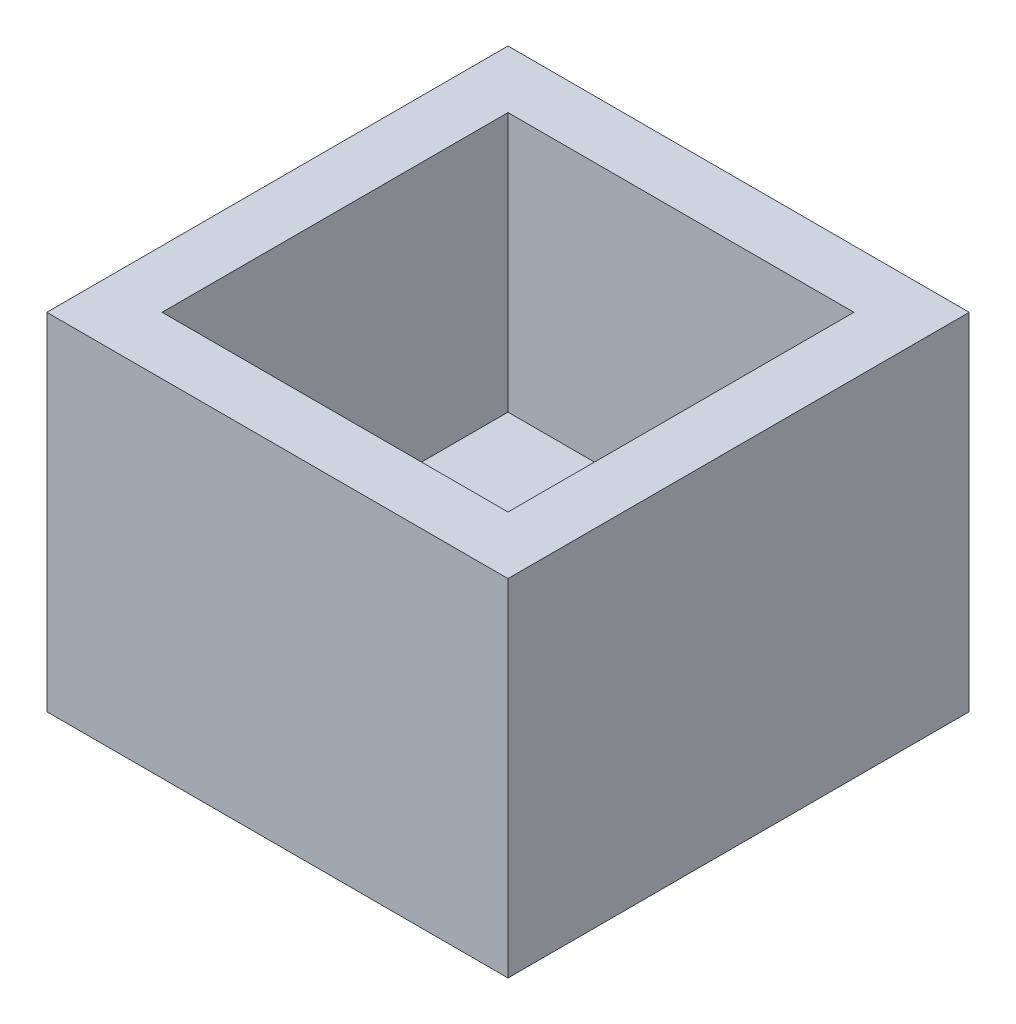
ISO-10303-21;
HEADER;
FILE_DESCRIPTION(('STEP AP214'),'2;1');
FILE_NAME('part.step','',(''),(''),'','','');
FILE_SCHEMA(('AUTOMOTIVE_DESIGN { 1 0 10303 214 1 1 1 1 }'));
ENDSEC;
DATA;
#1=APPLICATION_CONTEXT('core data for automotive mechanical design processes');
#2=APPLICATION_PROTOCOL_DEFINITION('international standard','automotive_design',2000,#1);
#3=PRODUCT_CONTEXT('',#1,'mechanical');
#4=PRODUCT('Part','Part','',(#3));
#5=PRODUCT_RELATED_PRODUCT_CATEGORY('part','',(#4));
#6=PRODUCT_DEFINITION_FORMATION('','',#4);
#7=PRODUCT_DEFINITION_CONTEXT('part definition',#1,'design');
#8=PRODUCT_DEFINITION('design','',#6,#7);
#9=PRODUCT_DEFINITION_SHAPE('','',#8);
#10=(LENGTH_UNIT() NAMED_UNIT(*) SI_UNIT(.MILLI.,.METRE.));
#11=(NAMED_UNIT(*) PLANE_ANGLE_UNIT() SI_UNIT($,.RADIAN.));
#12=(NAMED_UNIT(*) SI_UNIT($,.STERADIAN.) SOLID_ANGLE_UNIT());
#13=UNCERTAINTY_MEASURE_WITH_UNIT(LENGTH_MEASURE(1.E-05),#10,'distance_accuracy_value','');
#14=(GEOMETRIC_REPRESENTATION_CONTEXT(3) GLOBAL_UNCERTAINTY_ASSIGNED_CONTEXT((#13)) GLOBAL_UNIT_ASSIGNED_CONTEXT((#10,
#11,#12)) REPRESENTATION_CONTEXT('',''));
#15=CARTESIAN_POINT('',(0.,0.,0.));
#16=DIRECTION('',(0.,0.,1.));
#17=DIRECTION('',(1.,0.,0.));
#18=AXIS2_PLACEMENT_3D('',#15,#16,#17);
#19=CARTESIAN_POINT('',(50.8,76.2,50.8));
#20=DIRECTION('',(-1.,0.,0.));
#21=DIRECTION('',(0.,0.,1.));
#22=AXIS2_PLACEMENT_3D('',#19,#20,#21);
#23=PLANE('',#22);
#24=DIRECTION('',(0.,0.,-1.));
#25=VECTOR('',#24,1.);
#26=CARTESIAN_POINT('',(50.8,0.,50.8));
#27=LINE('',#26,#25);
#28=CARTESIAN_POINT('',(50.8,0.,50.8));
#29=VERTEX_POINT('',#28);
#30=CARTESIAN_POINT('',(50.8,0.,-50.8));
#31=VERTEX_POINT('',#30);
#32=EDGE_CURVE('E164',#29,#31,#27,.T.);
#33=ORIENTED_EDGE('',*,*,#32,.T.);
#34=DIRECTION('',(0.,-1.,0.));
#35=VECTOR('',#34,1.);
#36=CARTESIAN_POINT('',(50.8,76.2,-50.8));
#37=LINE('',#36,#35);
#38=CARTESIAN_POINT('',(50.8,76.2,-50.8));
#39=VERTEX_POINT('',#38);
#40=EDGE_CURVE('E11',#39,#31,#37,.T.);
#41=ORIENTED_EDGE('',*,*,#40,.F.);
#42=DIRECTION('',(0.,0.,-1.));
#43=VECTOR('',#42,1.);
#44=CARTESIAN_POINT('',(50.8,76.2,50.8));
#45=LINE('',#44,#43);
#46=CARTESIAN_POINT('',(50.8,76.2,50.8));
#47=VERTEX_POINT('',#46);
#48=EDGE_CURVE('E170',#47,#39,#45,.T.);
#49=ORIENTED_EDGE('',*,*,#48,.F.);
#50=DIRECTION('',(0.,-1.,0.));
#51=VECTOR('',#50,1.);
#52=CARTESIAN_POINT('',(50.8,76.2,50.8));
#53=LINE('',#52,#51);
#54=EDGE_CURVE('E180',#47,#29,#53,.T.);
#55=ORIENTED_EDGE('',*,*,#54,.T.);
#56=EDGE_LOOP('',(#33,#41,#49,#55));
#57=FACE_BOUND('',#56,.T.);
#58=ADVANCED_FACE('F45',(#57),#23,.F.);
#59=CARTESIAN_POINT('',(-50.8,76.2,-50.8));
#60=DIRECTION('',(0.,0.,1.));
#61=DIRECTION('',(1.,0.,0.));
#62=AXIS2_PLACEMENT_3D('',#59,#60,#61);
#63=PLANE('',#62);
#64=DIRECTION('',(-1.,0.,0.));
#65=VECTOR('',#64,1.);
#66=CARTESIAN_POINT('',(-50.8,0.,-50.8));
#67=LINE('',#66,#65);
#68=CARTESIAN_POINT('',(-50.8,0.,-50.8));
#69=VERTEX_POINT('',#68);
#70=EDGE_CURVE('E184',#31,#69,#67,.T.);
#71=ORIENTED_EDGE('',*,*,#70,.T.);
#72=DIRECTION('',(0.,-1.,0.));
#73=VECTOR('',#72,1.);
#74=CARTESIAN_POINT('',(-50.8,76.2,-50.8));
#75=LINE('',#74,#73);
#76=CARTESIAN_POINT('',(-50.8,76.2,-50.8));
#77=VERTEX_POINT('',#76);
#78=EDGE_CURVE('E53',#77,#69,#75,.T.);
#79=ORIENTED_EDGE('',*,*,#78,.F.);
#80=DIRECTION('',(-1.,0.,0.));
#81=VECTOR('',#80,1.);
#82=CARTESIAN_POINT('',(-50.8,76.2,-50.8));
#83=LINE('',#82,#81);
#84=EDGE_CURVE('E97',#39,#77,#83,.T.);
#85=ORIENTED_EDGE('',*,*,#84,.F.);
#86=ORIENTED_EDGE('',*,*,#40,.T.);
#87=EDGE_LOOP('',(#71,#79,#85,#86));
#88=FACE_BOUND('',#87,.T.);
#89=ADVANCED_FACE('F220',(#88),#63,.F.);
#90=CARTESIAN_POINT('',(-50.8,76.2,50.8));
#91=DIRECTION('',(1.,0.,0.));
#92=DIRECTION('',(0.,0.,-1.));
#93=AXIS2_PLACEMENT_3D('',#90,#91,#92);
#94=PLANE('',#93);
#95=DIRECTION('',(0.,0.,1.));
#96=VECTOR('',#95,1.);
#97=CARTESIAN_POINT('',(-50.8,0.,50.8));
#98=LINE('',#97,#96);
#99=CARTESIAN_POINT('',(-50.8,0.,50.8));
#100=VERTEX_POINT('',#99);
#101=EDGE_CURVE('E187',#69,#100,#98,.T.);
#102=ORIENTED_EDGE('',*,*,#101,.T.);
#103=DIRECTION('',(0.,-1.,0.));
#104=VECTOR('',#103,1.);
#105=CARTESIAN_POINT('',(-50.8,76.2,50.8));
#106=LINE('',#105,#104);
#107=CARTESIAN_POINT('',(-50.8,76.2,50.8));
#108=VERTEX_POINT('',#107);
#109=EDGE_CURVE('E194',#108,#100,#106,.T.);
#110=ORIENTED_EDGE('',*,*,#109,.F.);
#111=DIRECTION('',(0.,0.,1.));
#112=VECTOR('',#111,1.);
#113=CARTESIAN_POINT('',(-50.8,76.2,50.8));
#114=LINE('',#113,#112);
#115=EDGE_CURVE('E175',#77,#108,#114,.T.);
#116=ORIENTED_EDGE('',*,*,#115,.F.);
#117=ORIENTED_EDGE('',*,*,#78,.T.);
#118=EDGE_LOOP('',(#102,#110,#116,#117));
#119=FACE_BOUND('',#118,.T.);
#120=ADVANCED_FACE('F201',(#119),#94,.F.);
#121=CARTESIAN_POINT('',(-50.8,76.2,50.8));
#122=DIRECTION('',(0.,0.,-1.));
#123=DIRECTION('',(-1.,0.,0.));
#124=AXIS2_PLACEMENT_3D('',#121,#122,#123);
#125=PLANE('',#124);
#126=DIRECTION('',(1.,0.,0.));
#127=VECTOR('',#126,1.);
#128=CARTESIAN_POINT('',(-50.8,0.,50.8));
#129=LINE('',#128,#127);
#130=EDGE_CURVE('E90',#100,#29,#129,.T.);
#131=ORIENTED_EDGE('',*,*,#130,.T.);
#132=ORIENTED_EDGE('',*,*,#54,.F.);
#133=DIRECTION('',(1.,0.,0.));
#134=VECTOR('',#133,1.);
#135=CARTESIAN_POINT('',(-50.8,76.2,50.8));
#136=LINE('',#135,#134);
#137=EDGE_CURVE('E69',#108,#47,#136,.T.);
#138=ORIENTED_EDGE('',*,*,#137,.F.);
#139=ORIENTED_EDGE('',*,*,#109,.T.);
#140=EDGE_LOOP('',(#131,#132,#138,#139));
#141=FACE_BOUND('',#140,.T.);
#142=ADVANCED_FACE('F209',(#141),#125,.F.);
#143=CARTESIAN_POINT('',(0.,76.2,0.));
#144=DIRECTION('',(0.,-1.,0.));
#145=DIRECTION('',(0.,0.,-1.));
#146=AXIS2_PLACEMENT_3D('',#143,#144,#145);
#147=PLANE('',#146);
#148=DIRECTION('',(-1.,0.,0.));
#149=VECTOR('',#148,1.);
#150=CARTESIAN_POINT('',(-38.1,76.2,-38.1));
#151=LINE('',#150,#149);
#152=CARTESIAN_POINT('',(38.1,76.2,-38.1));
#153=VERTEX_POINT('',#152);
#154=CARTESIAN_POINT('',(-38.1,76.2,-38.1));
#155=VERTEX_POINT('',#154);
#156=EDGE_CURVE('E155',#153,#155,#151,.T.);
#157=ORIENTED_EDGE('',*,*,#156,.F.);
#158=DIRECTION('',(0.,0.,-1.));
#159=VECTOR('',#158,1.);
#160=CARTESIAN_POINT('',(38.1,76.2,38.1));
#161=LINE('',#160,#159);
#162=CARTESIAN_POINT('',(38.1,76.2,38.1));
#163=VERTEX_POINT('',#162);
#164=EDGE_CURVE('E60',#163,#153,#161,.T.);
#165=ORIENTED_EDGE('',*,*,#164,.F.);
#166=DIRECTION('',(1.,0.,0.));
#167=VECTOR('',#166,1.);
#168=CARTESIAN_POINT('',(-38.1,76.2,38.1));
#169=LINE('',#168,#167);
#170=CARTESIAN_POINT('',(-38.1,76.2,38.1));
#171=VERTEX_POINT('',#170);
#172=EDGE_CURVE('E142',#171,#163,#169,.T.);
#173=ORIENTED_EDGE('',*,*,#172,.F.);
#174=DIRECTION('',(0.,0.,1.));
#175=VECTOR('',#174,1.);
#176=CARTESIAN_POINT('',(-38.1,76.2,38.1));
#177=LINE('',#176,#175);
#178=EDGE_CURVE('E146',#155,#171,#177,.T.);
#179=ORIENTED_EDGE('',*,*,#178,.F.);
#180=EDGE_LOOP('',(#157,#165,#173,#179));
#181=FACE_BOUND('',#180,.T.);
#182=ORIENTED_EDGE('',*,*,#48,.T.);
#183=ORIENTED_EDGE('',*,*,#84,.T.);
#184=ORIENTED_EDGE('',*,*,#115,.T.);
#185=ORIENTED_EDGE('',*,*,#137,.T.);
#186=EDGE_LOOP('',(#182,#183,#184,#185));
#187=FACE_BOUND('',#186,.T.);
#188=ADVANCED_FACE('F211',(#181,#187),#147,.F.);
#189=CARTESIAN_POINT('',(0.,0.,0.));
#190=DIRECTION('',(0.,-1.,0.));
#191=DIRECTION('',(0.,0.,-1.));
#192=AXIS2_PLACEMENT_3D('',#189,#190,#191);
#193=PLANE('',#192);
#194=ORIENTED_EDGE('',*,*,#32,.F.);
#195=ORIENTED_EDGE('',*,*,#130,.F.);
#196=ORIENTED_EDGE('',*,*,#101,.F.);
#197=ORIENTED_EDGE('',*,*,#70,.F.);
#198=EDGE_LOOP('',(#194,#195,#196,#197));
#199=FACE_BOUND('',#198,.T.);
#200=ADVANCED_FACE('F205',(#199),#193,.T.);
#201=CARTESIAN_POINT('',(38.1,19.05,38.1));
#202=DIRECTION('',(1.,0.,0.));
#203=DIRECTION('',(0.,0.,-1.));
#204=AXIS2_PLACEMENT_3D('',#201,#202,#203);
#205=PLANE('',#204);
#206=ORIENTED_EDGE('',*,*,#164,.T.);
#207=DIRECTION('',(0.,1.,0.));
#208=VECTOR('',#207,1.);
#209=CARTESIAN_POINT('',(38.1,19.05,-38.1));
#210=LINE('',#209,#208);
#211=CARTESIAN_POINT('',(38.1,19.05,-38.1));
#212=VERTEX_POINT('',#211);
#213=EDGE_CURVE('E117',#212,#153,#210,.T.);
#214=ORIENTED_EDGE('',*,*,#213,.F.);
#215=DIRECTION('',(0.,0.,-1.));
#216=VECTOR('',#215,1.);
#217=CARTESIAN_POINT('',(38.1,19.05,38.1));
#218=LINE('',#217,#216);
#219=CARTESIAN_POINT('',(38.1,19.05,38.1));
#220=VERTEX_POINT('',#219);
#221=EDGE_CURVE('E121',#220,#212,#218,.T.);
#222=ORIENTED_EDGE('',*,*,#221,.F.);
#223=DIRECTION('',(0.,1.,0.));
#224=VECTOR('',#223,1.);
#225=CARTESIAN_POINT('',(38.1,19.05,38.1));
#226=LINE('',#225,#224);
#227=EDGE_CURVE('E161',#220,#163,#226,.T.);
#228=ORIENTED_EDGE('',*,*,#227,.T.);
#229=EDGE_LOOP('',(#206,#214,#222,#228));
#230=FACE_BOUND('',#229,.T.);
#231=ADVANCED_FACE('F119',(#230),#205,.F.);
#232=CARTESIAN_POINT('',(-38.1,19.05,38.1));
#233=DIRECTION('',(0.,0.,1.));
#234=DIRECTION('',(1.,0.,0.));
#235=AXIS2_PLACEMENT_3D('',#232,#233,#234);
#236=PLANE('',#235);
#237=ORIENTED_EDGE('',*,*,#172,.T.);
#238=ORIENTED_EDGE('',*,*,#227,.F.);
#239=DIRECTION('',(1.,0.,0.));
#240=VECTOR('',#239,1.);
#241=CARTESIAN_POINT('',(-38.1,19.05,38.1));
#242=LINE('',#241,#240);
#243=CARTESIAN_POINT('',(-38.1,19.05,38.1));
#244=VERTEX_POINT('',#243);
#245=EDGE_CURVE('E128',#244,#220,#242,.T.);
#246=ORIENTED_EDGE('',*,*,#245,.F.);
#247=DIRECTION('',(0.,1.,0.));
#248=VECTOR('',#247,1.);
#249=CARTESIAN_POINT('',(-38.1,19.05,38.1));
#250=LINE('',#249,#248);
#251=EDGE_CURVE('E165',#244,#171,#250,.T.);
#252=ORIENTED_EDGE('',*,*,#251,.T.);
#253=EDGE_LOOP('',(#237,#238,#246,#252));
#254=FACE_BOUND('',#253,.T.);
#255=ADVANCED_FACE('F260',(#254),#236,.F.);
#256=CARTESIAN_POINT('',(-38.1,19.05,38.1));
#257=DIRECTION('',(-1.,0.,0.));
#258=DIRECTION('',(0.,0.,1.));
#259=AXIS2_PLACEMENT_3D('',#256,#257,#258);
#260=PLANE('',#259);
#261=ORIENTED_EDGE('',*,*,#178,.T.);
#262=ORIENTED_EDGE('',*,*,#251,.F.);
#263=DIRECTION('',(0.,0.,1.));
#264=VECTOR('',#263,1.);
#265=CARTESIAN_POINT('',(-38.1,19.05,38.1));
#266=LINE('',#265,#264);
#267=CARTESIAN_POINT('',(-38.1,19.05,-38.1));
#268=VERTEX_POINT('',#267);
#269=EDGE_CURVE('E137',#268,#244,#266,.T.);
#270=ORIENTED_EDGE('',*,*,#269,.F.);
#271=DIRECTION('',(0.,1.,0.));
#272=VECTOR('',#271,1.);
#273=CARTESIAN_POINT('',(-38.1,19.05,-38.1));
#274=LINE('',#273,#272);
#275=EDGE_CURVE('E127',#268,#155,#274,.T.);
#276=ORIENTED_EDGE('',*,*,#275,.T.);
#277=EDGE_LOOP('',(#261,#262,#270,#276));
#278=FACE_BOUND('',#277,.T.);
#279=ADVANCED_FACE('F269',(#278),#260,.F.);
#280=CARTESIAN_POINT('',(-38.1,19.05,-38.1));
#281=DIRECTION('',(0.,0.,-1.));
#282=DIRECTION('',(-1.,0.,0.));
#283=AXIS2_PLACEMENT_3D('',#280,#281,#282);
#284=PLANE('',#283);
#285=ORIENTED_EDGE('',*,*,#156,.T.);
#286=ORIENTED_EDGE('',*,*,#275,.F.);
#287=DIRECTION('',(-1.,0.,0.));
#288=VECTOR('',#287,1.);
#289=CARTESIAN_POINT('',(-38.1,19.05,-38.1));
#290=LINE('',#289,#288);
#291=EDGE_CURVE('E131',#212,#268,#290,.T.);
#292=ORIENTED_EDGE('',*,*,#291,.F.);
#293=ORIENTED_EDGE('',*,*,#213,.T.);
#294=EDGE_LOOP('',(#285,#286,#292,#293));
#295=FACE_BOUND('',#294,.T.);
#296=ADVANCED_FACE('F132',(#295),#284,.F.);
#297=CARTESIAN_POINT('',(0.,19.05,0.));
#298=DIRECTION('',(0.,-1.,0.));
#299=DIRECTION('',(0.,0.,-1.));
#300=AXIS2_PLACEMENT_3D('',#297,#298,#299);
#301=PLANE('',#300);
#302=ORIENTED_EDGE('',*,*,#221,.T.);
#303=ORIENTED_EDGE('',*,*,#291,.T.);
#304=ORIENTED_EDGE('',*,*,#269,.T.);
#305=ORIENTED_EDGE('',*,*,#245,.T.);
#306=EDGE_LOOP('',(#302,#303,#304,#305));
#307=FACE_BOUND('',#306,.T.);
#308=ADVANCED_FACE('F139',(#307),#301,.F.);
#309=CLOSED_SHELL('',(#58,#89,#120,#142,#188,#200,#231,#255,#279,#296,#308));
#310=MANIFOLD_SOLID_BREP('B2',#309);
#311=ADVANCED_BREP_SHAPE_REPRESENTATION('',(#18,#310),#14);
#312=SHAPE_DEFINITION_REPRESENTATION(#9,#311);
ENDSEC;
END-ISO-10303-21;
